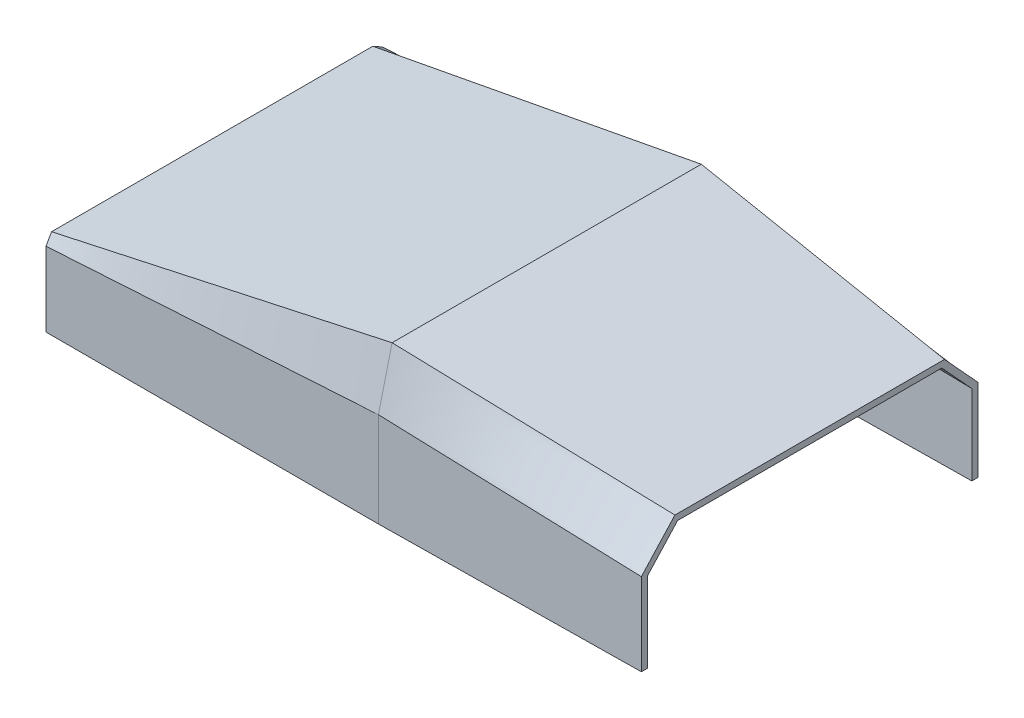
ISO-10303-21;
HEADER;
FILE_DESCRIPTION(('STEP AP214'),'2;1');
FILE_NAME('part.step','',(''),(''),'','','');
FILE_SCHEMA(('AUTOMOTIVE_DESIGN { 1 0 10303 214 1 1 1 1 }'));
ENDSEC;
DATA;
#1=APPLICATION_CONTEXT('core data for automotive mechanical design processes');
#2=APPLICATION_PROTOCOL_DEFINITION('international standard','automotive_design',2000,#1);
#3=PRODUCT_CONTEXT('',#1,'mechanical');
#4=PRODUCT('Part','Part','',(#3));
#5=PRODUCT_RELATED_PRODUCT_CATEGORY('part','',(#4));
#6=PRODUCT_DEFINITION_FORMATION('','',#4);
#7=PRODUCT_DEFINITION_CONTEXT('part definition',#1,'design');
#8=PRODUCT_DEFINITION('design','',#6,#7);
#9=PRODUCT_DEFINITION_SHAPE('','',#8);
#10=(LENGTH_UNIT() NAMED_UNIT(*) SI_UNIT(.MILLI.,.METRE.));
#11=(NAMED_UNIT(*) PLANE_ANGLE_UNIT() SI_UNIT($,.RADIAN.));
#12=(NAMED_UNIT(*) SI_UNIT($,.STERADIAN.) SOLID_ANGLE_UNIT());
#13=UNCERTAINTY_MEASURE_WITH_UNIT(LENGTH_MEASURE(1.E-05),#10,'distance_accuracy_value','');
#14=(GEOMETRIC_REPRESENTATION_CONTEXT(3) GLOBAL_UNCERTAINTY_ASSIGNED_CONTEXT((#13)) GLOBAL_UNIT_ASSIGNED_CONTEXT((#10,
#11,#12)) REPRESENTATION_CONTEXT('',''));
#15=CARTESIAN_POINT('',(0.,0.,0.));
#16=DIRECTION('',(0.,0.,1.));
#17=DIRECTION('',(1.,0.,0.));
#18=AXIS2_PLACEMENT_3D('',#15,#16,#17);
#19=CARTESIAN_POINT('',(-114.331486137845,0.,-5.61210936789388E-05));
#20=DIRECTION('',(-0.99999999999988,0.,-4.9086297724906E-07));
#21=DIRECTION('',(-4.9086297724906E-07,0.,0.99999999999988));
#22=AXIS2_PLACEMENT_3D('',#19,#20,#21);
#23=PLANE('',#22);
#24=DIRECTION('',(0.,-1.,0.));
#25=VECTOR('',#24,1.);
#26=CARTESIAN_POINT('',(-114.331488189809,114.880889414161,4.18026355239972));
#27=LINE('',#26,#25);
#28=CARTESIAN_POINT('',(-114.331488189809,114.880889414161,4.18026355239972));
#29=VERTEX_POINT('',#28);
#30=CARTESIAN_POINT('',(-114.331488189809,70.0559157212426,4.18026355239971));
#31=VERTEX_POINT('',#30);
#32=EDGE_CURVE('E440',#29,#31,#27,.T.);
#33=ORIENTED_EDGE('',*,*,#32,.T.);
#34=DIRECTION('',(-4.9086297724906E-07,0.,0.99999999999988));
#35=VECTOR('',#34,1.);
#36=CARTESIAN_POINT('',(-114.331488189809,70.0559157212426,4.18026355239971));
#37=LINE('',#36,#35);
#38=CARTESIAN_POINT('',(-114.331489907829,70.0559157212426,7.68026355239887));
#39=VERTEX_POINT('',#38);
#40=EDGE_CURVE('E121',#31,#39,#37,.T.);
#41=ORIENTED_EDGE('',*,*,#40,.T.);
#42=DIRECTION('',(0.,1.,0.));
#43=VECTOR('',#42,1.);
#44=CARTESIAN_POINT('',(-114.331489907829,70.0559157212426,7.68026355239887));
#45=LINE('',#44,#43);
#46=CARTESIAN_POINT('',(-114.331489907829,112.843431854654,7.68026355239885));
#47=VERTEX_POINT('',#46);
#48=EDGE_CURVE('E628',#39,#47,#45,.T.);
#49=ORIENTED_EDGE('',*,*,#48,.T.);
#50=DIRECTION('',(-4.26845180020486E-07,0.493790103568343,0.869581125380366));
#51=VECTOR('',#50,1.);
#52=CARTESIAN_POINT('',(-114.331489907829,112.843431854654,7.68026355239885));
#53=LINE('',#52,#51);
#54=CARTESIAN_POINT('',(-114.331491388145,114.555915721243,10.696005741525));
#55=VERTEX_POINT('',#54);
#56=EDGE_CURVE('E618',#47,#55,#53,.T.);
#57=ORIENTED_EDGE('',*,*,#56,.T.);
#58=DIRECTION('',(-4.90862979377344E-07,0.,0.99999999999988));
#59=VECTOR('',#58,1.);
#60=CARTESIAN_POINT('',(-114.331491388145,114.555915721243,10.696005741525));
#61=LINE('',#60,#59);
#62=CARTESIAN_POINT('',(-114.331578335567,114.555915721243,187.827761782464));
#63=VERTEX_POINT('',#62);
#64=EDGE_CURVE('E340',#55,#63,#61,.T.);
#65=ORIENTED_EDGE('',*,*,#64,.T.);
#66=DIRECTION('',(-2.42383280998615E-07,-0.869581125380471,0.493790103568282));
#67=VECTOR('',#66,1.);
#68=CARTESIAN_POINT('',(-114.331578335567,114.555915721243,187.827761782464));
#69=LINE('',#68,#67);
#70=CARTESIAN_POINT('',(-114.33158071748,106.010495471872,192.680263552354));
#71=VERTEX_POINT('',#70);
#72=EDGE_CURVE('E321',#63,#71,#69,.T.);
#73=ORIENTED_EDGE('',*,*,#72,.T.);
#74=DIRECTION('',(0.,-1.,0.));
#75=VECTOR('',#74,1.);
#76=CARTESIAN_POINT('',(-114.33158071748,106.010495471872,192.680263552354));
#77=LINE('',#76,#75);
#78=CARTESIAN_POINT('',(-114.33158071748,70.0559157212427,192.680263552354));
#79=VERTEX_POINT('',#78);
#80=EDGE_CURVE('E581',#71,#79,#77,.T.);
#81=ORIENTED_EDGE('',*,*,#80,.T.);
#82=DIRECTION('',(-4.90862981214148E-07,0.,0.99999999999988));
#83=VECTOR('',#82,1.);
#84=CARTESIAN_POINT('',(-114.33158071748,70.0559157212427,192.680263552354));
#85=LINE('',#84,#83);
#86=CARTESIAN_POINT('',(-114.331582435501,70.0559157212427,196.180263552353));
#87=VERTEX_POINT('',#86);
#88=EDGE_CURVE('E262',#79,#87,#85,.T.);
#89=ORIENTED_EDGE('',*,*,#88,.T.);
#90=DIRECTION('',(0.,1.,0.));
#91=VECTOR('',#90,1.);
#92=CARTESIAN_POINT('',(-114.331582435501,70.0559157212427,196.180263552353));
#93=LINE('',#92,#91);
#94=CARTESIAN_POINT('',(-114.331582435501,112.464586674198,196.180263552353));
#95=VERTEX_POINT('',#94);
#96=EDGE_CURVE('E557',#87,#95,#93,.T.);
#97=ORIENTED_EDGE('',*,*,#96,.T.);
#98=DIRECTION('',(2.42383282918923E-07,0.869581125380473,-0.493790103568278));
#99=VECTOR('',#98,1.);
#100=CARTESIAN_POINT('',(-114.331582435501,112.464586674198,196.180263552353));
#101=LINE('',#100,#99);
#102=CARTESIAN_POINT('',(-114.331580876998,118.055915721243,193.005237245271));
#103=VERTEX_POINT('',#102);
#104=EDGE_CURVE('E1084',#95,#103,#101,.T.);
#105=ORIENTED_EDGE('',*,*,#104,.T.);
#106=DIRECTION('',(4.90862979299535E-07,0.,-0.999999999999879));
#107=VECTOR('',#106,1.);
#108=CARTESIAN_POINT('',(-114.331580876998,118.055915721243,193.005237245271));
#109=LINE('',#108,#107);
#110=CARTESIAN_POINT('',(-114.331490934385,118.055915721243,9.77159259944362));
#111=VERTEX_POINT('',#110);
#112=EDGE_CURVE('E477',#103,#111,#109,.T.);
#113=ORIENTED_EDGE('',*,*,#112,.T.);
#114=DIRECTION('',(4.26845183010632E-07,-0.493790103568343,-0.869581125380365));
#115=VECTOR('',#114,1.);
#116=CARTESIAN_POINT('',(-114.331490934385,118.055915721243,9.77159259944362));
#117=LINE('',#116,#115);
#118=EDGE_CURVE('E453',#111,#29,#117,.T.);
#119=ORIENTED_EDGE('',*,*,#118,.T.);
#120=EDGE_LOOP('',(#33,#41,#49,#57,#65,#73,#81,#89,#97,#105,#113,#119));
#121=FACE_BOUND('',#120,.T.);
#122=ADVANCED_FACE('F93',(#121),#23,.T.);
#123=CARTESIAN_POINT('',(-19.5409462899084,136.868507334471,190.681237873663));
#124=DIRECTION('',(0.194667925585738,-0.980869205729359,4.86917551993266E-08));
#125=DIRECTION('',(0.98086920572936,0.194667925585739,0.));
#126=AXIS2_PLACEMENT_3D('',#123,#124,#125);
#127=PLANE('',#126);
#128=DIRECTION('',(0.980585712591791,0.19461161572673,-0.0240411997429762));
#129=VECTOR('',#128,1.);
#130=CARTESIAN_POINT('',(-114.331580876998,118.055915721243,193.005237245271));
#131=LINE('',#130,#129);
#132=CARTESIAN_POINT('',(75.2496882971812,155.681098947699,188.357238502054));
#133=VERTEX_POINT('',#132);
#134=EDGE_CURVE('E471',#103,#133,#131,.T.);
#135=ORIENTED_EDGE('',*,*,#134,.T.);
#136=DIRECTION('',(0.,0.,-1.));
#137=VECTOR('',#136,1.);
#138=CARTESIAN_POINT('',(75.2496882971812,155.681098947699,188.357238502054));
#139=LINE('',#138,#137);
#140=CARTESIAN_POINT('',(75.2496882971823,155.681098947699,12.0034747195067));
#141=VERTEX_POINT('',#140);
#142=EDGE_CURVE('E691',#133,#141,#139,.T.);
#143=ORIENTED_EDGE('',*,*,#142,.T.);
#144=DIRECTION('',(0.98080380688227,0.194654992086927,0.0115467077942188));
#145=VECTOR('',#144,1.);
#146=CARTESIAN_POINT('',(-114.331490934385,118.055915721243,9.77159259944362));
#147=LINE('',#146,#145);
#148=EDGE_CURVE('E467',#111,#141,#147,.T.);
#149=ORIENTED_EDGE('',*,*,#148,.F.);
#150=ORIENTED_EDGE('',*,*,#112,.F.);
#151=EDGE_LOOP('',(#135,#143,#149,#150));
#152=FACE_BOUND('',#151,.T.);
#153=ADVANCED_FACE('F484',(#152),#127,.F.);
#154=CARTESIAN_POINT('',(-114.331488189809,114.880889414161,4.18026355239971));
#155=CARTESIAN_POINT('',(75.2496882971824,124.055915721243,4.18035661078083));
#156=CARTESIAN_POINT('',(-114.331488647238,115.410060465341,5.11215172690694));
#157=CARTESIAN_POINT('',(75.2496882971823,129.326779592319,5.48420962890186));
#158=CARTESIAN_POINT('',(-114.331489104668,115.939231516521,6.04403990141421));
#159=CARTESIAN_POINT('',(75.2496882971823,134.597643463395,6.78806264702287));
#160=CARTESIAN_POINT('',(-114.331490019526,116.997573618882,7.90781625042884));
#161=CARTESIAN_POINT('',(75.2496882971823,145.139371205547,9.39576868326482));
#162=CARTESIAN_POINT('',(-114.331490476956,117.526744670062,8.83970442493621));
#163=CARTESIAN_POINT('',(75.2496882971823,150.410235076623,10.6996217013858));
#164=CARTESIAN_POINT('',(-114.331490934385,118.055915721243,9.77159259944362));
#165=CARTESIAN_POINT('',(75.2496882971823,155.681098947699,12.0034747195067));
#166=B_SPLINE_SURFACE_WITH_KNOTS('',3,1,((#154,#155),(#156,#157),(#158,#159),(#160,#161),(#162,
#163),(#164,#165)),.UNSPECIFIED.,.F.,.F.,.F.,(4,2,4),(2,2),(0.,0.5,1.),(0.,1.),.UNSPECIFIED.);
#167=DIRECTION('',(0.,-0.970740266108687,-0.240131913237779));
#168=VECTOR('',#167,1.);
#169=CARTESIAN_POINT('',(75.2496882971823,155.681098947699,12.0034747195067));
#170=LINE('',#169,#168);
#171=CARTESIAN_POINT('',(75.2496882971824,124.055915721243,4.18035661078083));
#172=VERTEX_POINT('',#171);
#173=EDGE_CURVE('E456',#141,#172,#170,.T.);
#174=DIRECTION('',(0.998830952583301,0.0483397161896409,4.90289137233347E-07));
#175=VECTOR('',#174,1.);
#176=CARTESIAN_POINT('',(-114.331488189809,114.880889414161,4.18026355239972));
#177=LINE('',#176,#175);
#178=EDGE_CURVE('E243',#29,#172,#177,.T.);
#179=ORIENTED_EDGE('',*,*,#118,.F.);
#180=ORIENTED_EDGE('',*,*,#148,.T.);
#181=ORIENTED_EDGE('',*,*,#173,.T.);
#182=ORIENTED_EDGE('',*,*,#178,.F.);
#183=EDGE_LOOP('',(#179,#180,#181,#182));
#184=FACE_BOUND('',#183,.T.);
#185=ADVANCED_FACE('F451',(#184),#166,.T.);
#186=CARTESIAN_POINT('',(-114.331580876998,118.055915721243,193.005237245271));
#187=CARTESIAN_POINT('',(75.2496882971812,155.681098947699,188.357238502054));
#188=CARTESIAN_POINT('',(-114.331581136748,117.124027546735,193.534408296452));
#189=CARTESIAN_POINT('',(75.2496882971812,150.410235076623,189.661091520175));
#190=CARTESIAN_POINT('',(-114.331581396499,116.192139372228,194.063579347632));
#191=CARTESIAN_POINT('',(75.2496882971812,145.139371205547,190.964944538296));
#192=CARTESIAN_POINT('',(-114.331581916,114.328363023213,195.121921449992));
#193=CARTESIAN_POINT('',(75.2496882971811,134.597643463395,193.572650574538));
#194=CARTESIAN_POINT('',(-114.33158217575,113.396474848705,195.651092501172));
#195=CARTESIAN_POINT('',(75.2496882971811,129.326779592319,194.876503592659));
#196=CARTESIAN_POINT('',(-114.331582435501,112.464586674198,196.180263552353));
#197=CARTESIAN_POINT('',(75.2496882971811,124.055915721243,196.18035661078));
#198=B_SPLINE_SURFACE_WITH_KNOTS('',3,1,((#186,#187),(#188,#189),(#190,#191),(#192,#193),(#194,
#195),(#196,#197)),.UNSPECIFIED.,.F.,.F.,.F.,(4,2,4),(2,2),(0.,0.5,1.),(0.,1.),.UNSPECIFIED.);
#199=DIRECTION('',(0.998136068068596,0.0610277774486498,4.89948044021697E-07));
#200=VECTOR('',#199,1.);
#201=CARTESIAN_POINT('',(-19.5409470691598,118.26025119772,196.180310081566));
#202=LINE('',#201,#200);
#203=CARTESIAN_POINT('',(75.2496882971811,124.055915721243,196.18035661078));
#204=VERTEX_POINT('',#203);
#205=EDGE_CURVE('E470',#95,#204,#202,.T.);
#206=DIRECTION('',(0.,0.970740266108686,-0.240131913237782));
#207=VECTOR('',#206,1.);
#208=CARTESIAN_POINT('',(75.2496882971811,124.055915721243,196.18035661078));
#209=LINE('',#208,#207);
#210=EDGE_CURVE('E98',#204,#133,#209,.T.);
#211=ORIENTED_EDGE('',*,*,#104,.F.);
#212=ORIENTED_EDGE('',*,*,#205,.T.);
#213=ORIENTED_EDGE('',*,*,#210,.T.);
#214=ORIENTED_EDGE('',*,*,#134,.F.);
#215=EDGE_LOOP('',(#211,#212,#213,#214));
#216=FACE_BOUND('',#215,.T.);
#217=ADVANCED_FACE('F521',(#216),#198,.T.);
#218=CARTESIAN_POINT('',(-9.62976561758219E-05,0.,196.180319673447));
#219=DIRECTION('',(-4.90862979202518E-07,0.,0.99999999999988));
#220=DIRECTION('',(0.99999999999988,0.,4.90862979202518E-07));
#221=AXIS2_PLACEMENT_3D('',#218,#219,#220);
#222=PLANE('',#221);
#223=DIRECTION('',(0.999999999999879,0.,4.90862979202518E-07));
#224=VECTOR('',#223,1.);
#225=CARTESIAN_POINT('',(-114.331582435501,70.0559157212427,196.180263552353));
#226=LINE('',#225,#224);
#227=CARTESIAN_POINT('',(75.2496882971811,70.0559157212426,196.18035661078));
#228=VERTEX_POINT('',#227);
#229=EDGE_CURVE('E268',#87,#228,#226,.T.);
#230=ORIENTED_EDGE('',*,*,#229,.T.);
#231=DIRECTION('',(0.,1.,0.));
#232=VECTOR('',#231,1.);
#233=CARTESIAN_POINT('',(75.2496882971811,70.0559157212426,196.18035661078));
#234=LINE('',#233,#232);
#235=EDGE_CURVE('E242',#228,#204,#234,.T.);
#236=ORIENTED_EDGE('',*,*,#235,.T.);
#237=ORIENTED_EDGE('',*,*,#205,.F.);
#238=ORIENTED_EDGE('',*,*,#96,.F.);
#239=EDGE_LOOP('',(#230,#236,#237,#238));
#240=FACE_BOUND('',#239,.T.);
#241=ADVANCED_FACE('F531',(#240),#222,.T.);
#242=CARTESIAN_POINT('',(0.,70.0559157212427,0.));
#243=DIRECTION('',(0.,-1.,0.));
#244=DIRECTION('',(1.,0.,0.));
#245=AXIS2_PLACEMENT_3D('',#242,#243,#244);
#246=PLANE('',#245);
#247=DIRECTION('',(0.999999999999879,0.,4.9086297896586E-07));
#248=VECTOR('',#247,1.);
#249=CARTESIAN_POINT('',(-114.33158071748,70.0559157212427,192.680263552354));
#250=LINE('',#249,#248);
#251=CARTESIAN_POINT('',(75.2496882971811,70.0559157212426,192.68035661078));
#252=VERTEX_POINT('',#251);
#253=EDGE_CURVE('E259',#79,#252,#250,.T.);
#254=ORIENTED_EDGE('',*,*,#253,.T.);
#255=DIRECTION('',(0.,0.,1.));
#256=VECTOR('',#255,1.);
#257=CARTESIAN_POINT('',(75.2496882971811,70.0559157212426,192.68035661078));
#258=LINE('',#257,#256);
#259=EDGE_CURVE('E228',#252,#228,#258,.T.);
#260=ORIENTED_EDGE('',*,*,#259,.T.);
#261=ORIENTED_EDGE('',*,*,#229,.F.);
#262=ORIENTED_EDGE('',*,*,#88,.F.);
#263=EDGE_LOOP('',(#254,#260,#261,#262));
#264=FACE_BOUND('',#263,.T.);
#265=ADVANCED_FACE('F260',(#264),#246,.T.);
#266=CARTESIAN_POINT('',(-9.45796357030141E-05,0.,192.680319673447));
#267=DIRECTION('',(4.9086297896586E-07,0.,-0.99999999999988));
#268=DIRECTION('',(-0.99999999999988,0.,-4.9086297896586E-07));
#269=AXIS2_PLACEMENT_3D('',#266,#267,#268);
#270=PLANE('',#269);
#271=DIRECTION('',(0.997069650123104,0.0764991032833119,4.89424578695934E-07));
#272=VECTOR('',#271,1.);
#273=CARTESIAN_POINT('',(-114.33158071748,106.010495471872,192.680263552354));
#274=LINE('',#273,#272);
#275=CARTESIAN_POINT('',(75.2496882971811,120.555915721243,192.68035661078));
#276=VERTEX_POINT('',#275);
#277=EDGE_CURVE('E267',#71,#276,#274,.T.);
#278=ORIENTED_EDGE('',*,*,#277,.T.);
#279=DIRECTION('',(0.,-1.,0.));
#280=VECTOR('',#279,1.);
#281=CARTESIAN_POINT('',(75.2496882971811,70.0559157212426,192.68035661078));
#282=LINE('',#281,#280);
#283=EDGE_CURVE('E12',#276,#252,#282,.T.);
#284=ORIENTED_EDGE('',*,*,#283,.T.);
#285=ORIENTED_EDGE('',*,*,#253,.F.);
#286=ORIENTED_EDGE('',*,*,#80,.F.);
#287=EDGE_LOOP('',(#278,#284,#285,#286));
#288=FACE_BOUND('',#287,.T.);
#289=ADVANCED_FACE('F272',(#288),#270,.T.);
#290=CARTESIAN_POINT('',(-114.33158071748,106.010495471872,192.680263552354));
#291=CARTESIAN_POINT('',(75.2496882971811,120.555915721243,192.68035661078));
#292=CARTESIAN_POINT('',(-114.331580320495,107.4347321801,191.871513257372));
#293=CARTESIAN_POINT('',(75.2496882971812,125.826779592319,191.376503592659));
#294=CARTESIAN_POINT('',(-114.331579923509,108.858968888329,191.06276296239));
#295=CARTESIAN_POINT('',(75.2496882971812,131.097643463395,190.072650574538));
#296=CARTESIAN_POINT('',(-114.331579129538,111.707442304786,189.445262372427));
#297=CARTESIAN_POINT('',(75.2496882971812,141.639371205547,187.464944538296));
#298=CARTESIAN_POINT('',(-114.331578732552,113.131679013014,188.636512077445));
#299=CARTESIAN_POINT('',(75.2496882971812,146.910235076623,186.161091520175));
#300=CARTESIAN_POINT('',(-114.331578335567,114.555915721243,187.827761782464));
#301=CARTESIAN_POINT('',(75.2496882971812,152.181098947699,184.857238502054));
#302=B_SPLINE_SURFACE_WITH_KNOTS('',3,1,((#290,#291),(#292,#293),(#294,#295),(#296,#297),(#298,
#299),(#300,#301)),.UNSPECIFIED.,.F.,.F.,.F.,(4,2,4),(2,2),(0.,0.5,1.),(0.,1.),.UNSPECIFIED.);
#303=DIRECTION('',(0.98075338933265,0.194644896244377,-0.0153672924920218));
#304=VECTOR('',#303,1.);
#305=CARTESIAN_POINT('',(-19.5409450191928,133.368507334471,186.342500142259));
#306=LINE('',#305,#304);
#307=CARTESIAN_POINT('',(75.2496882971812,152.181098947699,184.857238502054));
#308=VERTEX_POINT('',#307);
#309=EDGE_CURVE('E314',#63,#308,#306,.T.);
#310=DIRECTION('',(0.,-0.970740266108686,0.240131913237782));
#311=VECTOR('',#310,1.);
#312=CARTESIAN_POINT('',(75.2496882971812,152.181098947699,184.857238502054));
#313=LINE('',#312,#311);
#314=EDGE_CURVE('E105',#308,#276,#313,.T.);
#315=ORIENTED_EDGE('',*,*,#72,.F.);
#316=ORIENTED_EDGE('',*,*,#309,.T.);
#317=ORIENTED_EDGE('',*,*,#314,.T.);
#318=ORIENTED_EDGE('',*,*,#277,.F.);
#319=EDGE_LOOP('',(#315,#316,#317,#318));
#320=FACE_BOUND('',#319,.T.);
#321=ADVANCED_FACE('F293',(#320),#302,.T.);
#322=CARTESIAN_POINT('',(-19.5409015454815,133.368507334471,13.0997402305159));
#323=DIRECTION('',(-0.194667926090747,0.980869205629132,-4.8850163901337E-08));
#324=DIRECTION('',(-0.980869205629133,-0.194667926090747,0.));
#325=AXIS2_PLACEMENT_3D('',#322,#323,#324);
#326=PLANE('',#325);
#327=DIRECTION('',(0.980565916640673,0.194607778791444,0.0248655495916878));
#328=VECTOR('',#327,1.);
#329=CARTESIAN_POINT('',(-114.331491388145,114.555915721243,10.696005741525));
#330=LINE('',#329,#328);
#331=CARTESIAN_POINT('',(75.2496882971823,152.181098947699,15.5034747195067));
#332=VERTEX_POINT('',#331);
#333=EDGE_CURVE('E333',#55,#332,#330,.T.);
#334=ORIENTED_EDGE('',*,*,#333,.T.);
#335=DIRECTION('',(0.,0.,1.));
#336=VECTOR('',#335,1.);
#337=CARTESIAN_POINT('',(75.2496882971812,152.181098947699,184.857238502054));
#338=LINE('',#337,#336);
#339=EDGE_CURVE('E664',#332,#308,#338,.T.);
#340=ORIENTED_EDGE('',*,*,#339,.T.);
#341=ORIENTED_EDGE('',*,*,#309,.F.);
#342=ORIENTED_EDGE('',*,*,#64,.F.);
#343=EDGE_LOOP('',(#334,#340,#341,#342));
#344=FACE_BOUND('',#343,.T.);
#345=ADVANCED_FACE('F346',(#344),#326,.F.);
#346=CARTESIAN_POINT('',(-114.331491388145,114.555915721243,10.696005741525));
#347=CARTESIAN_POINT('',(75.2496882971823,152.181098947699,15.5034747195067));
#348=CARTESIAN_POINT('',(-114.331491141426,114.270501743478,10.1933820433373));
#349=CARTESIAN_POINT('',(75.2496882971823,146.910235076623,14.1996217013857));
#350=CARTESIAN_POINT('',(-114.331490894707,113.985087765713,9.69075834514958));
#351=CARTESIAN_POINT('',(75.2496882971823,141.639371205547,12.8957686832648));
#352=CARTESIAN_POINT('',(-114.331490401268,113.414259810183,8.68551094877419));
#353=CARTESIAN_POINT('',(75.2496882971823,131.097643463395,10.2880626470228));
#354=CARTESIAN_POINT('',(-114.331490154549,113.128845832419,8.18288725058651));
#355=CARTESIAN_POINT('',(75.2496882971823,125.826779592319,8.98420962890182));
#356=CARTESIAN_POINT('',(-114.331489907829,112.843431854654,7.68026355239885));
#357=CARTESIAN_POINT('',(75.2496882971823,120.555915721243,7.68035661078083));
#358=B_SPLINE_SURFACE_WITH_KNOTS('',3,1,((#346,#347),(#348,#349),(#350,#351),(#352,#353),(#354,
#355),(#356,#357)),.UNSPECIFIED.,.F.,.F.,.F.,(4,2,4),(2,2),(0.,0.5,1.),(0.,1.),.UNSPECIFIED.);
#359=DIRECTION('',(0.999173525523866,0.0406480736563,4.9045729370234E-07));
#360=VECTOR('',#359,1.);
#361=CARTESIAN_POINT('',(-19.5409008053234,116.699673787948,7.68031008158984));
#362=LINE('',#361,#360);
#363=CARTESIAN_POINT('',(75.2496882971823,120.555915721243,7.68035661078083));
#364=VERTEX_POINT('',#363);
#365=EDGE_CURVE('E422',#47,#364,#362,.T.);
#366=DIRECTION('',(0.,0.970740266108687,0.240131913237779));
#367=VECTOR('',#366,1.);
#368=CARTESIAN_POINT('',(75.2496882971823,152.181098947699,15.5034747195067));
#369=LINE('',#368,#367);
#370=EDGE_CURVE('E376',#364,#332,#369,.T.);
#371=ORIENTED_EDGE('',*,*,#56,.F.);
#372=ORIENTED_EDGE('',*,*,#365,.T.);
#373=ORIENTED_EDGE('',*,*,#370,.T.);
#374=ORIENTED_EDGE('',*,*,#333,.F.);
#375=EDGE_LOOP('',(#371,#372,#373,#374));
#376=FACE_BOUND('',#375,.T.);
#377=ADVANCED_FACE('F355',(#376),#358,.T.);
#378=CARTESIAN_POINT('',(-3.76998459717291E-06,0.,7.68031967349279));
#379=DIRECTION('',(-4.90862979334553E-07,0.,0.99999999999988));
#380=DIRECTION('',(0.99999999999988,0.,4.90862979334553E-07));
#381=AXIS2_PLACEMENT_3D('',#378,#379,#380);
#382=PLANE('',#381);
#383=DIRECTION('',(0.999999999999879,0.,4.90862979334553E-07));
#384=VECTOR('',#383,1.);
#385=CARTESIAN_POINT('',(-114.331489907829,70.0559157212426,7.68026355239887));
#386=LINE('',#385,#384);
#387=CARTESIAN_POINT('',(75.2496882971823,70.0559157212426,7.68035661078083));
#388=VERTEX_POINT('',#387);
#389=EDGE_CURVE('E413',#39,#388,#386,.T.);
#390=ORIENTED_EDGE('',*,*,#389,.T.);
#391=DIRECTION('',(0.,1.,0.));
#392=VECTOR('',#391,1.);
#393=CARTESIAN_POINT('',(75.2496882971823,70.0559157212426,7.68035661078083));
#394=LINE('',#393,#392);
#395=EDGE_CURVE('E390',#388,#364,#394,.T.);
#396=ORIENTED_EDGE('',*,*,#395,.T.);
#397=ORIENTED_EDGE('',*,*,#365,.F.);
#398=ORIENTED_EDGE('',*,*,#48,.F.);
#399=EDGE_LOOP('',(#390,#396,#397,#398));
#400=FACE_BOUND('',#399,.T.);
#401=ADVANCED_FACE('F396',(#400),#382,.T.);
#402=CARTESIAN_POINT('',(0.,70.0559157212426,0.));
#403=DIRECTION('',(0.,-1.,0.));
#404=DIRECTION('',(1.,0.,0.));
#405=AXIS2_PLACEMENT_3D('',#402,#403,#404);
#406=PLANE('',#405);
#407=DIRECTION('',(0.999999999999879,0.,4.90862979335803E-07));
#408=VECTOR('',#407,1.);
#409=CARTESIAN_POINT('',(-114.331488189809,70.0559157212426,4.18026355239971));
#410=LINE('',#409,#408);
#411=CARTESIAN_POINT('',(75.2496882971824,70.0559157212426,4.18035661078083));
#412=VERTEX_POINT('',#411);
#413=EDGE_CURVE('E421',#31,#412,#410,.T.);
#414=ORIENTED_EDGE('',*,*,#413,.T.);
#415=DIRECTION('',(0.,0.,1.));
#416=VECTOR('',#415,1.);
#417=CARTESIAN_POINT('',(75.2496882971823,70.0559157212426,7.68035661078083));
#418=LINE('',#417,#416);
#419=EDGE_CURVE('E678',#412,#388,#418,.T.);
#420=ORIENTED_EDGE('',*,*,#419,.T.);
#421=ORIENTED_EDGE('',*,*,#389,.F.);
#422=ORIENTED_EDGE('',*,*,#40,.F.);
#423=EDGE_LOOP('',(#414,#420,#421,#422));
#424=FACE_BOUND('',#423,.T.);
#425=ADVANCED_FACE('F404',(#424),#406,.T.);
#426=CARTESIAN_POINT('',(-2.05196416948828E-06,0.,4.18031967349363));
#427=DIRECTION('',(4.90862979331228E-07,0.,-0.99999999999988));
#428=DIRECTION('',(-0.99999999999988,0.,-4.90862979331228E-07));
#429=AXIS2_PLACEMENT_3D('',#426,#427,#428);
#430=PLANE('',#429);
#431=ORIENTED_EDGE('',*,*,#178,.T.);
#432=DIRECTION('',(0.,-1.,0.));
#433=VECTOR('',#432,1.);
#434=CARTESIAN_POINT('',(75.2496882971824,70.0559157212426,4.18035661078083));
#435=LINE('',#434,#433);
#436=EDGE_CURVE('E681',#172,#412,#435,.T.);
#437=ORIENTED_EDGE('',*,*,#436,.T.);
#438=ORIENTED_EDGE('',*,*,#413,.F.);
#439=ORIENTED_EDGE('',*,*,#32,.F.);
#440=EDGE_LOOP('',(#431,#437,#438,#439));
#441=FACE_BOUND('',#440,.T.);
#442=ADVANCED_FACE('F95',(#441),#430,.T.);
#443=CARTESIAN_POINT('',(225.249688297182,0.,0.));
#444=DIRECTION('',(-1.,0.,0.));
#445=DIRECTION('',(0.,0.,1.));
#446=AXIS2_PLACEMENT_3D('',#443,#444,#445);
#447=PLANE('',#446);
#448=DIRECTION('',(0.,0.,1.));
#449=VECTOR('',#448,1.);
#450=CARTESIAN_POINT('',(225.249688297182,72.0559157212427,4.1803566107804));
#451=LINE('',#450,#449);
#452=CARTESIAN_POINT('',(225.249688297182,72.0559157212427,4.1803566107804));
#453=VERTEX_POINT('',#452);
#454=CARTESIAN_POINT('',(225.249688297182,72.0559157212427,7.68035661078039));
#455=VERTEX_POINT('',#454);
#456=EDGE_CURVE('E720',#453,#455,#451,.T.);
#457=ORIENTED_EDGE('',*,*,#456,.F.);
#458=DIRECTION('',(0.,-1.,0.));
#459=VECTOR('',#458,1.);
#460=CARTESIAN_POINT('',(225.249688297182,119.044016941925,4.18035661078039));
#461=LINE('',#460,#459);
#462=CARTESIAN_POINT('',(225.249688297182,119.044016941925,4.18035661078039));
#463=VERTEX_POINT('',#462);
#464=EDGE_CURVE('E446',#463,#453,#461,.T.);
#465=ORIENTED_EDGE('',*,*,#464,.F.);
#466=DIRECTION('',(0.,-0.737298149176399,-0.675567494201029));
#467=VECTOR('',#466,1.);
#468=CARTESIAN_POINT('',(225.249688297182,139.915463657847,23.3043310490405));
#469=LINE('',#468,#467);
#470=CARTESIAN_POINT('',(225.249688297182,139.915463657847,23.3043310490405));
#471=VERTEX_POINT('',#470);
#472=EDGE_CURVE('E967',#471,#463,#469,.T.);
#473=ORIENTED_EDGE('',*,*,#472,.F.);
#474=DIRECTION('',(0.,0.,-1.));
#475=VECTOR('',#474,1.);
#476=CARTESIAN_POINT('',(225.249688297182,139.915463657847,177.05638217252));
#477=LINE('',#476,#475);
#478=CARTESIAN_POINT('',(225.249688297182,139.915463657847,177.05638217252));
#479=VERTEX_POINT('',#478);
#480=EDGE_CURVE('E985',#479,#471,#477,.T.);
#481=ORIENTED_EDGE('',*,*,#480,.F.);
#482=DIRECTION('',(0.,0.737298149176386,-0.675567494201043));
#483=VECTOR('',#482,1.);
#484=CARTESIAN_POINT('',(225.249688297182,119.044016941925,196.18035661078));
#485=LINE('',#484,#483);
#486=CARTESIAN_POINT('',(225.249688297182,119.044016941925,196.18035661078));
#487=VERTEX_POINT('',#486);
#488=EDGE_CURVE('E714',#487,#479,#485,.T.);
#489=ORIENTED_EDGE('',*,*,#488,.F.);
#490=DIRECTION('',(0.,1.,0.));
#491=VECTOR('',#490,1.);
#492=CARTESIAN_POINT('',(225.249688297182,72.0559157212427,196.18035661078));
#493=LINE('',#492,#491);
#494=CARTESIAN_POINT('',(225.249688297182,72.0559157212427,196.18035661078));
#495=VERTEX_POINT('',#494);
#496=EDGE_CURVE('E764',#495,#487,#493,.T.);
#497=ORIENTED_EDGE('',*,*,#496,.F.);
#498=DIRECTION('',(0.,0.,1.));
#499=VECTOR('',#498,1.);
#500=CARTESIAN_POINT('',(225.249688297182,72.0559157212427,192.68035661078));
#501=LINE('',#500,#499);
#502=CARTESIAN_POINT('',(225.249688297182,72.0559157212427,192.68035661078));
#503=VERTEX_POINT('',#502);
#504=EDGE_CURVE('E1007',#503,#495,#501,.T.);
#505=ORIENTED_EDGE('',*,*,#504,.F.);
#506=DIRECTION('',(0.,-1.,0.));
#507=VECTOR('',#506,1.);
#508=CARTESIAN_POINT('',(225.249688297182,117.683003444717,192.68035661078));
#509=LINE('',#508,#507);
#510=CARTESIAN_POINT('',(225.249688297182,117.683003444717,192.68035661078));
#511=VERTEX_POINT('',#510);
#512=EDGE_CURVE('E254',#511,#503,#509,.T.);
#513=ORIENTED_EDGE('',*,*,#512,.F.);
#514=DIRECTION('',(0.,-0.737298149176385,0.675567494201044));
#515=VECTOR('',#514,1.);
#516=CARTESIAN_POINT('',(225.249688297182,136.415463657847,175.516280964393));
#517=LINE('',#516,#515);
#518=CARTESIAN_POINT('',(225.249688297182,136.415463657847,175.516280964393));
#519=VERTEX_POINT('',#518);
#520=EDGE_CURVE('E1026',#519,#511,#517,.T.);
#521=ORIENTED_EDGE('',*,*,#520,.F.);
#522=DIRECTION('',(0.,0.,1.));
#523=VECTOR('',#522,1.);
#524=CARTESIAN_POINT('',(225.249688297182,136.415463657847,24.8444322571675));
#525=LINE('',#524,#523);
#526=CARTESIAN_POINT('',(225.249688297182,136.415463657847,24.8444322571675));
#527=VERTEX_POINT('',#526);
#528=EDGE_CURVE('E854',#527,#519,#525,.T.);
#529=ORIENTED_EDGE('',*,*,#528,.F.);
#530=DIRECTION('',(0.,0.737298149176399,0.675567494201028));
#531=VECTOR('',#530,1.);
#532=CARTESIAN_POINT('',(225.249688297182,117.683003444717,7.68035661078039));
#533=LINE('',#532,#531);
#534=CARTESIAN_POINT('',(225.249688297182,117.683003444717,7.68035661078039));
#535=VERTEX_POINT('',#534);
#536=EDGE_CURVE('E868',#535,#527,#533,.T.);
#537=ORIENTED_EDGE('',*,*,#536,.F.);
#538=DIRECTION('',(0.,1.,0.));
#539=VECTOR('',#538,1.);
#540=CARTESIAN_POINT('',(225.249688297182,72.0559157212427,7.68035661078039));
#541=LINE('',#540,#539);
#542=EDGE_CURVE('E1060',#455,#535,#541,.T.);
#543=ORIENTED_EDGE('',*,*,#542,.F.);
#544=EDGE_LOOP('',(#457,#465,#473,#481,#489,#497,#505,#513,#521,#529,#537,#543));
#545=FACE_BOUND('',#544,.T.);
#546=ADVANCED_FACE('F745',(#545),#447,.F.);
#547=CARTESIAN_POINT('',(-0.920537502807692,69.0403127105761,0.));
#548=DIRECTION('',(0.0133321483061496,-0.999911122961208,0.));
#549=DIRECTION('',(0.999911122961208,0.0133321483061496,0.));
#550=AXIS2_PLACEMENT_3D('',#547,#548,#549);
#551=PLANE('',#550);
#552=DIRECTION('',(0.999911122961207,0.0133321483061496,0.));
#553=VECTOR('',#552,1.);
#554=CARTESIAN_POINT('',(75.2496882971811,70.0559157212426,192.68035661078));
#555=LINE('',#554,#553);
#556=EDGE_CURVE('E233',#252,#503,#555,.T.);
#557=ORIENTED_EDGE('',*,*,#556,.T.);
#558=ORIENTED_EDGE('',*,*,#504,.T.);
#559=DIRECTION('',(0.999911122961207,0.0133321483061496,0.));
#560=VECTOR('',#559,1.);
#561=CARTESIAN_POINT('',(75.2496882971811,70.0559157212426,196.18035661078));
#562=LINE('',#561,#560);
#563=EDGE_CURVE('E235',#228,#495,#562,.T.);
#564=ORIENTED_EDGE('',*,*,#563,.F.);
#565=ORIENTED_EDGE('',*,*,#259,.F.);
#566=EDGE_LOOP('',(#557,#558,#564,#565));
#567=FACE_BOUND('',#566,.T.);
#568=ADVANCED_FACE('F231',(#567),#551,.T.);
#569=CARTESIAN_POINT('',(-4.71908555924999E-13,0.,196.18035661078));
#570=DIRECTION('',(0.,0.,1.));
#571=DIRECTION('',(1.,0.,0.));
#572=AXIS2_PLACEMENT_3D('',#569,#570,#571);
#573=PLANE('',#572);
#574=ORIENTED_EDGE('',*,*,#563,.T.);
#575=ORIENTED_EDGE('',*,*,#496,.T.);
#576=DIRECTION('',(0.999442264076291,-0.0333940230888161,0.));
#577=VECTOR('',#576,1.);
#578=CARTESIAN_POINT('',(150.249688297181,121.549966331584,196.18035661078));
#579=LINE('',#578,#577);
#580=EDGE_CURVE('E113',#204,#487,#579,.T.);
#581=ORIENTED_EDGE('',*,*,#580,.F.);
#582=ORIENTED_EDGE('',*,*,#235,.F.);
#583=EDGE_LOOP('',(#574,#575,#581,#582));
#584=FACE_BOUND('',#583,.T.);
#585=ADVANCED_FACE('F770',(#584),#573,.T.);
#586=CARTESIAN_POINT('',(-5.01387287724727E-13,-1.17210071349906E-13,192.68035661078));
#587=DIRECTION('',(0.,0.,-1.));
#588=DIRECTION('',(-1.,0.,0.));
#589=AXIS2_PLACEMENT_3D('',#586,#587,#588);
#590=PLANE('',#589);
#591=DIRECTION('',(0.999816636557814,-0.0191492365962772,0.));
#592=VECTOR('',#591,1.);
#593=CARTESIAN_POINT('',(75.2496882971811,120.555915721243,192.68035661078));
#594=LINE('',#593,#592);
#595=EDGE_CURVE('E795',#276,#511,#594,.T.);
#596=ORIENTED_EDGE('',*,*,#595,.T.);
#597=ORIENTED_EDGE('',*,*,#512,.T.);
#598=ORIENTED_EDGE('',*,*,#556,.F.);
#599=ORIENTED_EDGE('',*,*,#283,.F.);
#600=EDGE_LOOP('',(#596,#597,#598,#599));
#601=FACE_BOUND('',#600,.T.);
#602=ADVANCED_FACE('F251',(#601),#590,.T.);
#603=CARTESIAN_POINT('',(75.2496882971811,120.555915721243,192.68035661078));
#604=CARTESIAN_POINT('',(225.249688297182,117.683003444717,192.68035661078));
#605=CARTESIAN_POINT('',(75.2496882971812,125.826779592319,191.376503592659));
#606=CARTESIAN_POINT('',(225.249688297182,120.805080146905,189.819677336382));
#607=CARTESIAN_POINT('',(75.2496882971812,131.097643463395,190.072650574538));
#608=CARTESIAN_POINT('',(225.249688297182,123.927156849094,186.958998061984));
#609=CARTESIAN_POINT('',(75.2496882971812,141.639371205547,187.464944538296));
#610=CARTESIAN_POINT('',(225.249688297182,130.171310253471,181.237639513188));
#611=CARTESIAN_POINT('',(75.2496882971812,146.910235076623,186.161091520175));
#612=CARTESIAN_POINT('',(225.249688297182,133.293386955659,178.376960238791));
#613=CARTESIAN_POINT('',(75.2496882971812,152.181098947699,184.857238502054));
#614=CARTESIAN_POINT('',(225.249688297182,136.415463657847,175.516280964393));
#615=B_SPLINE_SURFACE_WITH_KNOTS('',3,1,((#603,#604),(#605,#606),(#607,#608),(#609,#610),(#611,
#612),(#613,#614)),.UNSPECIFIED.,.F.,.F.,.F.,(4,2,4),(2,2),(0.,0.5,1.),(0.,1.),.UNSPECIFIED.);
#616=DIRECTION('',(0.992620089437808,-0.104328575409708,-0.0618134807097889));
#617=VECTOR('',#616,1.);
#618=CARTESIAN_POINT('',(150.249688297181,144.298281302773,180.186759733223));
#619=LINE('',#618,#617);
#620=EDGE_CURVE('E798',#308,#519,#619,.T.);
#621=ORIENTED_EDGE('',*,*,#314,.F.);
#622=ORIENTED_EDGE('',*,*,#620,.T.);
#623=ORIENTED_EDGE('',*,*,#520,.T.);
#624=ORIENTED_EDGE('',*,*,#595,.F.);
#625=EDGE_LOOP('',(#621,#622,#623,#624));
#626=FACE_BOUND('',#625,.T.);
#627=ADVANCED_FACE('F818',(#626),#615,.T.);
#628=CARTESIAN_POINT('',(16.6423079130238,158.3409828439,0.));
#629=DIRECTION('',(-0.104528463267654,-0.994521895368273,0.));
#630=DIRECTION('',(0.994521895368273,-0.104528463267654,0.));
#631=AXIS2_PLACEMENT_3D('',#628,#629,#630);
#632=PLANE('',#631);
#633=DIRECTION('',(0.992620089437808,-0.104328575409709,0.0618134807097848));
#634=VECTOR('',#633,1.);
#635=CARTESIAN_POINT('',(75.2496882971823,152.181098947699,15.5034747195067));
#636=LINE('',#635,#634);
#637=EDGE_CURVE('E802',#332,#527,#636,.T.);
#638=ORIENTED_EDGE('',*,*,#637,.T.);
#639=ORIENTED_EDGE('',*,*,#528,.T.);
#640=ORIENTED_EDGE('',*,*,#620,.F.);
#641=ORIENTED_EDGE('',*,*,#339,.F.);
#642=EDGE_LOOP('',(#638,#639,#640,#641));
#643=FACE_BOUND('',#642,.T.);
#644=ADVANCED_FACE('F829',(#643),#632,.T.);
#645=CARTESIAN_POINT('',(75.2496882971823,152.181098947699,15.5034747195067));
#646=CARTESIAN_POINT('',(225.249688297182,136.415463657847,24.8444322571675));
#647=CARTESIAN_POINT('',(75.2496882971823,146.910235076623,14.1996217013857));
#648=CARTESIAN_POINT('',(225.249688297182,133.293386955659,21.9837529827696));
#649=CARTESIAN_POINT('',(75.2496882971823,141.639371205547,12.8957686832648));
#650=CARTESIAN_POINT('',(225.249688297182,130.17131025347,19.1230737083718));
#651=CARTESIAN_POINT('',(75.2496882971823,131.097643463395,10.2880626470228));
#652=CARTESIAN_POINT('',(225.249688297182,123.927156849094,13.4017151595761));
#653=CARTESIAN_POINT('',(75.2496882971823,125.826779592319,8.98420962890182));
#654=CARTESIAN_POINT('',(225.249688297182,120.805080146905,10.5410358851782));
#655=CARTESIAN_POINT('',(75.2496882971823,120.555915721243,7.68035661078083));
#656=CARTESIAN_POINT('',(225.249688297182,117.683003444717,7.68035661078039));
#657=B_SPLINE_SURFACE_WITH_KNOTS('',3,1,((#645,#646),(#647,#648),(#649,#650),(#651,#652),(#653,
#654),(#655,#656)),.UNSPECIFIED.,.F.,.F.,.F.,(4,2,4),(2,2),(0.,0.5,1.),(0.,1.),.UNSPECIFIED.);
#658=DIRECTION('',(0.999816636557814,-0.0191492365962772,0.));
#659=VECTOR('',#658,1.);
#660=CARTESIAN_POINT('',(150.249688297182,119.11945958298,7.68035661078061));
#661=LINE('',#660,#659);
#662=EDGE_CURVE('E900',#364,#535,#661,.T.);
#663=ORIENTED_EDGE('',*,*,#370,.F.);
#664=ORIENTED_EDGE('',*,*,#662,.T.);
#665=ORIENTED_EDGE('',*,*,#536,.T.);
#666=ORIENTED_EDGE('',*,*,#637,.F.);
#667=EDGE_LOOP('',(#663,#664,#665,#666));
#668=FACE_BOUND('',#667,.T.);
#669=ADVANCED_FACE('F874',(#668),#657,.T.);
#670=CARTESIAN_POINT('',(0.,0.,7.68035661078105));
#671=DIRECTION('',(0.,0.,1.));
#672=DIRECTION('',(1.,0.,0.));
#673=AXIS2_PLACEMENT_3D('',#670,#671,#672);
#674=PLANE('',#673);
#675=DIRECTION('',(0.999911122961207,0.0133321483061499,0.));
#676=VECTOR('',#675,1.);
#677=CARTESIAN_POINT('',(75.2496882971823,70.0559157212426,7.68035661078083));
#678=LINE('',#677,#676);
#679=EDGE_CURVE('E908',#388,#455,#678,.T.);
#680=ORIENTED_EDGE('',*,*,#679,.T.);
#681=ORIENTED_EDGE('',*,*,#542,.T.);
#682=ORIENTED_EDGE('',*,*,#662,.F.);
#683=ORIENTED_EDGE('',*,*,#395,.F.);
#684=EDGE_LOOP('',(#680,#681,#682,#683));
#685=FACE_BOUND('',#684,.T.);
#686=ADVANCED_FACE('F885',(#685),#674,.T.);
#687=CARTESIAN_POINT('',(-0.920537502807711,69.0403127105761,0.));
#688=DIRECTION('',(0.0133321483061499,-0.999911122961207,0.));
#689=DIRECTION('',(0.999911122961207,0.0133321483061499,0.));
#690=AXIS2_PLACEMENT_3D('',#687,#688,#689);
#691=PLANE('',#690);
#692=DIRECTION('',(0.999911122961207,0.0133321483061499,0.));
#693=VECTOR('',#692,1.);
#694=CARTESIAN_POINT('',(75.2496882971824,70.0559157212426,4.18035661078083));
#695=LINE('',#694,#693);
#696=EDGE_CURVE('E926',#412,#453,#695,.T.);
#697=ORIENTED_EDGE('',*,*,#696,.T.);
#698=ORIENTED_EDGE('',*,*,#456,.T.);
#699=ORIENTED_EDGE('',*,*,#679,.F.);
#700=ORIENTED_EDGE('',*,*,#419,.F.);
#701=EDGE_LOOP('',(#697,#698,#699,#700));
#702=FACE_BOUND('',#701,.T.);
#703=ADVANCED_FACE('F936',(#702),#691,.T.);
#704=CARTESIAN_POINT('',(0.,0.,4.18035661078107));
#705=DIRECTION('',(0.,0.,-1.));
#706=DIRECTION('',(-1.,0.,0.));
#707=AXIS2_PLACEMENT_3D('',#704,#705,#706);
#708=PLANE('',#707);
#709=DIRECTION('',(0.999442264076291,-0.0333940230888164,0.));
#710=VECTOR('',#709,1.);
#711=CARTESIAN_POINT('',(75.2496882971824,124.055915721243,4.18035661078083));
#712=LINE('',#711,#710);
#713=EDGE_CURVE('E722',#172,#463,#712,.T.);
#714=ORIENTED_EDGE('',*,*,#713,.T.);
#715=ORIENTED_EDGE('',*,*,#464,.T.);
#716=ORIENTED_EDGE('',*,*,#696,.F.);
#717=ORIENTED_EDGE('',*,*,#436,.F.);
#718=EDGE_LOOP('',(#714,#715,#716,#717));
#719=FACE_BOUND('',#718,.T.);
#720=ADVANCED_FACE('F945',(#719),#708,.T.);
#721=CARTESIAN_POINT('',(75.2496882971824,124.055915721243,4.18035661078083));
#722=CARTESIAN_POINT('',(225.249688297182,119.044016941925,4.18035661078039));
#723=CARTESIAN_POINT('',(75.2496882971823,129.326779592319,5.48420962890186));
#724=CARTESIAN_POINT('',(225.249688297182,122.522591394579,7.36768568382379));
#725=CARTESIAN_POINT('',(75.2496882971823,134.597643463395,6.78806264702287));
#726=CARTESIAN_POINT('',(225.249688297182,126.001165847232,10.5550147568672));
#727=CARTESIAN_POINT('',(75.2496882971823,145.139371205547,9.39576868326482));
#728=CARTESIAN_POINT('',(225.249688297182,132.95831475254,16.9296729029539));
#729=CARTESIAN_POINT('',(75.2496882971823,150.410235076623,10.6996217013858));
#730=CARTESIAN_POINT('',(225.249688297182,136.436889205194,20.1170019759972));
#731=CARTESIAN_POINT('',(75.2496882971823,155.681098947699,12.0034747195067));
#732=CARTESIAN_POINT('',(225.249688297182,139.915463657847,23.3043310490405));
#733=B_SPLINE_SURFACE_WITH_KNOTS('',3,1,((#721,#722),(#723,#724),(#725,#726),(#727,#728),(#729,
#730),(#731,#732)),.UNSPECIFIED.,.F.,.F.,.F.,(4,2,4),(2,2),(0.,0.5,1.),(0.,1.),.UNSPECIFIED.);
#734=DIRECTION('',(0.991741994259627,-0.104236283887516,0.0747168919539562));
#735=VECTOR('',#734,1.);
#736=CARTESIAN_POINT('',(150.249688297182,147.798281302773,17.6539028842736));
#737=LINE('',#736,#735);
#738=EDGE_CURVE('E707',#141,#471,#737,.T.);
#739=ORIENTED_EDGE('',*,*,#173,.F.);
#740=ORIENTED_EDGE('',*,*,#738,.T.);
#741=ORIENTED_EDGE('',*,*,#472,.T.);
#742=ORIENTED_EDGE('',*,*,#713,.F.);
#743=EDGE_LOOP('',(#739,#740,#741,#742));
#744=FACE_BOUND('',#743,.T.);
#745=ADVANCED_FACE('F1155',(#744),#733,.T.);
#746=CARTESIAN_POINT('',(17.0061533719548,161.802741145184,0.));
#747=DIRECTION('',(0.104528463267653,0.994521895368274,0.));
#748=DIRECTION('',(-0.994521895368274,0.104528463267653,0.));
#749=AXIS2_PLACEMENT_3D('',#746,#747,#748);
#750=PLANE('',#749);
#751=DIRECTION('',(0.991741994259627,-0.104236283887515,-0.0747168919539605));
#752=VECTOR('',#751,1.);
#753=CARTESIAN_POINT('',(75.2496882971812,155.681098947699,188.357238502054));
#754=LINE('',#753,#752);
#755=EDGE_CURVE('E705',#133,#479,#754,.T.);
#756=ORIENTED_EDGE('',*,*,#755,.T.);
#757=ORIENTED_EDGE('',*,*,#480,.T.);
#758=ORIENTED_EDGE('',*,*,#738,.F.);
#759=ORIENTED_EDGE('',*,*,#142,.F.);
#760=EDGE_LOOP('',(#756,#757,#758,#759));
#761=FACE_BOUND('',#760,.T.);
#762=ADVANCED_FACE('F703',(#761),#750,.T.);
#763=CARTESIAN_POINT('',(75.2496882971812,155.681098947699,188.357238502054));
#764=CARTESIAN_POINT('',(225.249688297182,139.915463657847,177.05638217252));
#765=CARTESIAN_POINT('',(75.2496882971812,150.410235076623,189.661091520175));
#766=CARTESIAN_POINT('',(225.249688297182,136.436889205194,180.243711245563));
#767=CARTESIAN_POINT('',(75.2496882971812,145.139371205547,190.964944538296));
#768=CARTESIAN_POINT('',(225.249688297182,132.95831475254,183.431040318606));
#769=CARTESIAN_POINT('',(75.2496882971811,134.597643463395,193.572650574538));
#770=CARTESIAN_POINT('',(225.249688297182,126.001165847232,189.805698464693));
#771=CARTESIAN_POINT('',(75.2496882971811,129.326779592319,194.876503592659));
#772=CARTESIAN_POINT('',(225.249688297182,122.522591394579,192.993027537737));
#773=CARTESIAN_POINT('',(75.2496882971811,124.055915721243,196.18035661078));
#774=CARTESIAN_POINT('',(225.249688297182,119.044016941925,196.18035661078));
#775=B_SPLINE_SURFACE_WITH_KNOTS('',3,1,((#763,#764),(#765,#766),(#767,#768),(#769,#770),(#771,
#772),(#773,#774)),.UNSPECIFIED.,.F.,.F.,.F.,(4,2,4),(2,2),(0.,0.5,1.),(0.,1.),.UNSPECIFIED.);
#776=ORIENTED_EDGE('',*,*,#210,.F.);
#777=ORIENTED_EDGE('',*,*,#580,.T.);
#778=ORIENTED_EDGE('',*,*,#488,.T.);
#779=ORIENTED_EDGE('',*,*,#755,.F.);
#780=EDGE_LOOP('',(#776,#777,#778,#779));
#781=FACE_BOUND('',#780,.T.);
#782=ADVANCED_FACE('F712',(#781),#775,.T.);
#783=CLOSED_SHELL('',(#122,#153,#185,#217,#241,#265,#289,#321,#345,#377,#401,#425,#442,#546,
#568,#585,#602,#627,#644,#669,#686,#703,#720,#745,#762,#782));
#784=MANIFOLD_SOLID_BREP('B2',#783);
#785=ADVANCED_BREP_SHAPE_REPRESENTATION('',(#18,#784),#14);
#786=SHAPE_DEFINITION_REPRESENTATION(#9,#785);
ENDSEC;
END-ISO-10303-21;
